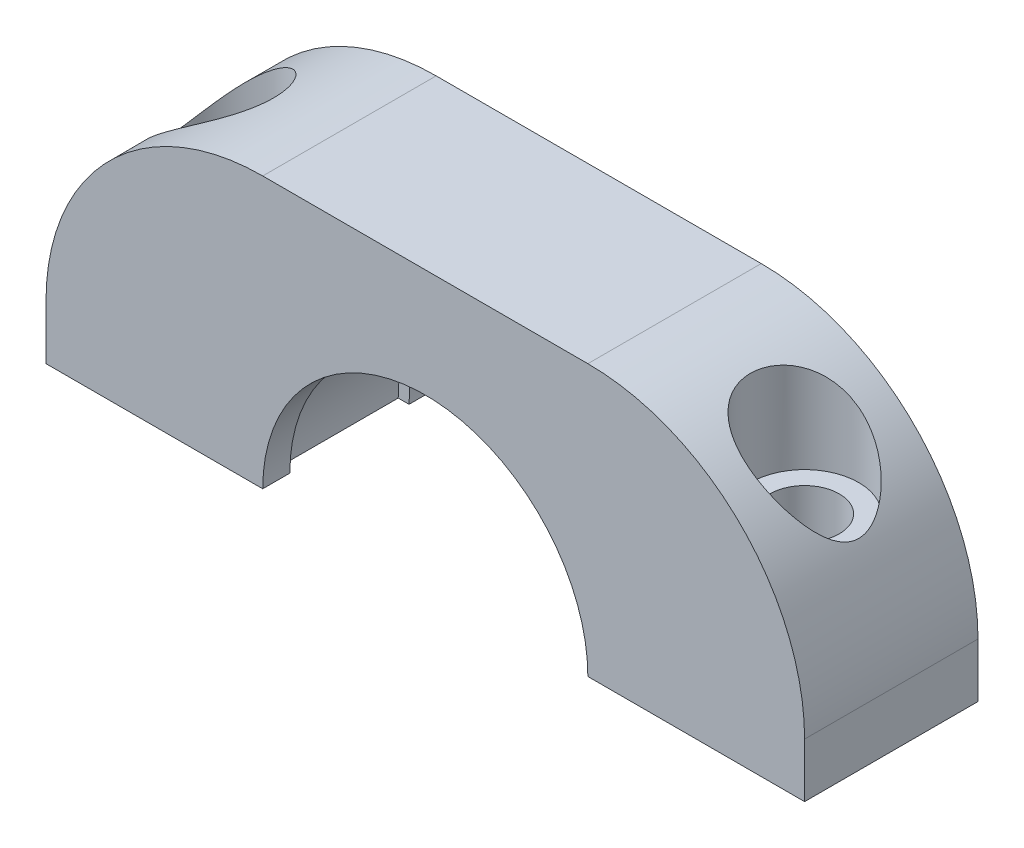
ISO-10303-21;
HEADER;
FILE_DESCRIPTION(('STEP AP214'),'2;1');
FILE_NAME('part.step','',(''),(''),'','','');
FILE_SCHEMA(('AUTOMOTIVE_DESIGN { 1 0 10303 214 1 1 1 1 }'));
ENDSEC;
DATA;
#1=APPLICATION_CONTEXT('core data for automotive mechanical design processes');
#2=APPLICATION_PROTOCOL_DEFINITION('international standard','automotive_design',2000,#1);
#3=PRODUCT_CONTEXT('',#1,'mechanical');
#4=PRODUCT('Part','Part','',(#3));
#5=PRODUCT_RELATED_PRODUCT_CATEGORY('part','',(#4));
#6=PRODUCT_DEFINITION_FORMATION('','',#4);
#7=PRODUCT_DEFINITION_CONTEXT('part definition',#1,'design');
#8=PRODUCT_DEFINITION('design','',#6,#7);
#9=PRODUCT_DEFINITION_SHAPE('','',#8);
#10=(LENGTH_UNIT() NAMED_UNIT(*) SI_UNIT(.MILLI.,.METRE.));
#11=(NAMED_UNIT(*) PLANE_ANGLE_UNIT() SI_UNIT($,.RADIAN.));
#12=(NAMED_UNIT(*) SI_UNIT($,.STERADIAN.) SOLID_ANGLE_UNIT());
#13=UNCERTAINTY_MEASURE_WITH_UNIT(LENGTH_MEASURE(1.E-05),#10,'distance_accuracy_value','');
#14=(GEOMETRIC_REPRESENTATION_CONTEXT(3) GLOBAL_UNCERTAINTY_ASSIGNED_CONTEXT((#13)) GLOBAL_UNIT_ASSIGNED_CONTEXT((#10,
#11,#12)) REPRESENTATION_CONTEXT('',''));
#15=CARTESIAN_POINT('',(0.,0.,0.));
#16=DIRECTION('',(0.,0.,1.));
#17=DIRECTION('',(1.,0.,0.));
#18=AXIS2_PLACEMENT_3D('',#15,#16,#17);
#19=CARTESIAN_POINT('',(0.,0.,0.));
#20=DIRECTION('',(0.,-1.,0.));
#21=DIRECTION('',(0.,0.,-1.));
#22=AXIS2_PLACEMENT_3D('',#19,#20,#21);
#23=PLANE('',#22);
#24=CARTESIAN_POINT('',(13.5000000000004,0.,0.));
#25=DIRECTION('',(0.,-1.,0.));
#26=DIRECTION('',(0.,0.,-1.));
#27=AXIS2_PLACEMENT_3D('',#24,#25,#26);
#28=CIRCLE('',#27,1.6);
#29=CARTESIAN_POINT('',(13.5000000000004,0.,-1.59999999999997));
#30=VERTEX_POINT('',#29);
#31=EDGE_CURVE('E154',#30,#30,#28,.T.);
#32=ORIENTED_EDGE('',*,*,#31,.F.);
#33=EDGE_LOOP('',(#32));
#34=FACE_BOUND('',#33,.T.);
#35=DIRECTION('',(0.,0.,1.));
#36=VECTOR('',#35,1.);
#37=CARTESIAN_POINT('',(8.,0.,-2.75));
#38=LINE('',#37,#36);
#39=CARTESIAN_POINT('',(8.,0.,-2.75));
#40=VERTEX_POINT('',#39);
#41=CARTESIAN_POINT('',(8.,0.,2.75));
#42=VERTEX_POINT('',#41);
#43=EDGE_CURVE('E140',#40,#42,#38,.T.);
#44=ORIENTED_EDGE('',*,*,#43,.F.);
#45=DIRECTION('',(-1.,0.,0.));
#46=VECTOR('',#45,1.);
#47=CARTESIAN_POINT('',(0.,0.,-2.75));
#48=LINE('',#47,#46);
#49=CARTESIAN_POINT('',(7.50000000000001,0.,-2.75));
#50=VERTEX_POINT('',#49);
#51=EDGE_CURVE('E149',#40,#50,#48,.T.);
#52=ORIENTED_EDGE('',*,*,#51,.T.);
#53=DIRECTION('',(0.,0.,1.));
#54=VECTOR('',#53,1.);
#55=CARTESIAN_POINT('',(7.50000000000001,0.,-4.00100000000001));
#56=LINE('',#55,#54);
#57=CARTESIAN_POINT('',(7.50000000000001,0.,-4.00000000000001));
#58=VERTEX_POINT('',#57);
#59=EDGE_CURVE('E169',#50,#58,#56,.F.);
#60=ORIENTED_EDGE('',*,*,#59,.T.);
#61=DIRECTION('',(-1.,0.,0.));
#62=VECTOR('',#61,1.);
#63=CARTESIAN_POINT('',(-17.5,0.,-4.00000000000001));
#64=LINE('',#63,#62);
#65=CARTESIAN_POINT('',(17.5,0.,-4.00000000000001));
#66=VERTEX_POINT('',#65);
#67=EDGE_CURVE('E189',#66,#58,#64,.T.);
#68=ORIENTED_EDGE('',*,*,#67,.F.);
#69=DIRECTION('',(0.,0.,-1.));
#70=VECTOR('',#69,1.);
#71=CARTESIAN_POINT('',(17.5,0.,3.99999999999999));
#72=LINE('',#71,#70);
#73=CARTESIAN_POINT('',(17.5,0.,3.99999999999999));
#74=VERTEX_POINT('',#73);
#75=EDGE_CURVE('E177',#74,#66,#72,.T.);
#76=ORIENTED_EDGE('',*,*,#75,.F.);
#77=DIRECTION('',(1.,0.,0.));
#78=VECTOR('',#77,1.);
#79=CARTESIAN_POINT('',(-17.5,0.,3.99999999999999));
#80=LINE('',#79,#78);
#81=CARTESIAN_POINT('',(7.50000000000001,0.,3.99999999999999));
#82=VERTEX_POINT('',#81);
#83=EDGE_CURVE('E195',#82,#74,#80,.T.);
#84=ORIENTED_EDGE('',*,*,#83,.F.);
#85=CARTESIAN_POINT('',(7.50000000000001,0.,2.75));
#86=VERTEX_POINT('',#85);
#87=EDGE_CURVE('E158',#82,#86,#56,.F.);
#88=ORIENTED_EDGE('',*,*,#87,.T.);
#89=DIRECTION('',(-1.,0.,0.));
#90=VECTOR('',#89,1.);
#91=CARTESIAN_POINT('',(0.,0.,2.75));
#92=LINE('',#91,#90);
#93=EDGE_CURVE('E65',#42,#86,#92,.T.);
#94=ORIENTED_EDGE('',*,*,#93,.F.);
#95=EDGE_LOOP('',(#44,#52,#60,#68,#76,#84,#88,#94));
#96=FACE_BOUND('',#95,.T.);
#97=ADVANCED_FACE('F43',(#34,#96),#23,.T.);
#98=CARTESIAN_POINT('',(-13.4999999999997,0.,0.));
#99=DIRECTION('',(0.,-1.,0.));
#100=DIRECTION('',(0.,0.,-1.));
#101=AXIS2_PLACEMENT_3D('',#98,#99,#100);
#102=CIRCLE('',#101,1.6);
#103=CARTESIAN_POINT('',(-13.4999999999997,0.,-1.60000000000006));
#104=VERTEX_POINT('',#103);
#105=EDGE_CURVE('E327',#104,#104,#102,.T.);
#106=ORIENTED_EDGE('',*,*,#105,.F.);
#107=EDGE_LOOP('',(#106));
#108=FACE_BOUND('',#107,.T.);
#109=DIRECTION('',(0.,0.,1.));
#110=VECTOR('',#109,1.);
#111=CARTESIAN_POINT('',(-7.49999999999999,0.,-4.00100000000001));
#112=LINE('',#111,#110);
#113=CARTESIAN_POINT('',(-7.49999999999999,0.,-4.00000000000001));
#114=VERTEX_POINT('',#113);
#115=CARTESIAN_POINT('',(-7.49999999999999,0.,-2.75));
#116=VERTEX_POINT('',#115);
#117=EDGE_CURVE('E166',#114,#116,#112,.T.);
#118=ORIENTED_EDGE('',*,*,#117,.T.);
#119=DIRECTION('',(-1.,0.,0.));
#120=VECTOR('',#119,1.);
#121=CARTESIAN_POINT('',(0.,0.,-2.75));
#122=LINE('',#121,#120);
#123=CARTESIAN_POINT('',(-8.,0.,-2.75));
#124=VERTEX_POINT('',#123);
#125=EDGE_CURVE('E159',#116,#124,#122,.T.);
#126=ORIENTED_EDGE('',*,*,#125,.T.);
#127=DIRECTION('',(0.,0.,1.));
#128=VECTOR('',#127,1.);
#129=CARTESIAN_POINT('',(-8.,0.,-2.75));
#130=LINE('',#129,#128);
#131=CARTESIAN_POINT('',(-8.,0.,2.75));
#132=VERTEX_POINT('',#131);
#133=EDGE_CURVE('E11',#132,#124,#130,.F.);
#134=ORIENTED_EDGE('',*,*,#133,.F.);
#135=DIRECTION('',(-1.,0.,0.));
#136=VECTOR('',#135,1.);
#137=CARTESIAN_POINT('',(0.,0.,2.75));
#138=LINE('',#137,#136);
#139=CARTESIAN_POINT('',(-7.49999999999999,0.,2.75));
#140=VERTEX_POINT('',#139);
#141=EDGE_CURVE('E153',#140,#132,#138,.T.);
#142=ORIENTED_EDGE('',*,*,#141,.F.);
#143=CARTESIAN_POINT('',(-7.49999999999999,0.,3.99999999999999));
#144=VERTEX_POINT('',#143);
#145=EDGE_CURVE('E148',#140,#144,#112,.T.);
#146=ORIENTED_EDGE('',*,*,#145,.T.);
#147=CARTESIAN_POINT('',(-17.5,0.,3.99999999999999));
#148=VERTEX_POINT('',#147);
#149=EDGE_CURVE('E182',#148,#144,#80,.T.);
#150=ORIENTED_EDGE('',*,*,#149,.F.);
#151=DIRECTION('',(0.,0.,1.));
#152=VECTOR('',#151,1.);
#153=CARTESIAN_POINT('',(-17.5,0.,3.99999999999999));
#154=LINE('',#153,#152);
#155=CARTESIAN_POINT('',(-17.5,0.,-4.00000000000001));
#156=VERTEX_POINT('',#155);
#157=EDGE_CURVE('E192',#156,#148,#154,.T.);
#158=ORIENTED_EDGE('',*,*,#157,.F.);
#159=EDGE_CURVE('E188',#114,#156,#64,.T.);
#160=ORIENTED_EDGE('',*,*,#159,.F.);
#161=EDGE_LOOP('',(#118,#126,#134,#142,#146,#150,#158,#160));
#162=FACE_BOUND('',#161,.T.);
#163=ADVANCED_FACE('F274',(#108,#162),#23,.T.);
#164=CARTESIAN_POINT('',(0.,0.,-4.00100000000001));
#165=DIRECTION('',(0.,0.,1.));
#166=DIRECTION('',(1.,0.,0.));
#167=AXIS2_PLACEMENT_3D('',#164,#165,#166);
#168=CYLINDRICAL_SURFACE('',#167,7.5);
#169=CARTESIAN_POINT('',(0.,0.,-2.75));
#170=DIRECTION('',(0.,0.,1.));
#171=DIRECTION('',(1.,0.,0.));
#172=AXIS2_PLACEMENT_3D('',#169,#170,#171);
#173=CIRCLE('',#172,7.5);
#174=EDGE_CURVE('E57',#116,#50,#173,.F.);
#175=ORIENTED_EDGE('',*,*,#174,.F.);
#176=ORIENTED_EDGE('',*,*,#117,.F.);
#177=CARTESIAN_POINT('',(0.,0.,-4.00000000000001));
#178=DIRECTION('',(0.,0.,1.));
#179=DIRECTION('',(1.,0.,0.));
#180=AXIS2_PLACEMENT_3D('',#177,#178,#179);
#181=CIRCLE('',#180,7.5);
#182=EDGE_CURVE('E174',#114,#58,#181,.F.);
#183=ORIENTED_EDGE('',*,*,#182,.T.);
#184=ORIENTED_EDGE('',*,*,#59,.F.);
#185=EDGE_LOOP('',(#175,#176,#183,#184));
#186=FACE_BOUND('',#185,.T.);
#187=ADVANCED_FACE('F267',(#186),#168,.F.);
#188=CARTESIAN_POINT('',(17.5,12.5,3.99999999999999));
#189=DIRECTION('',(-1.,0.,0.));
#190=DIRECTION('',(0.,0.,1.));
#191=AXIS2_PLACEMENT_3D('',#188,#189,#190);
#192=PLANE('',#191);
#193=DIRECTION('',(0.,-1.,0.));
#194=VECTOR('',#193,1.);
#195=CARTESIAN_POINT('',(17.5,12.5,-4.00000000000001));
#196=LINE('',#195,#194);
#197=CARTESIAN_POINT('',(17.5,2.5,-4.00000000000001));
#198=VERTEX_POINT('',#197);
#199=EDGE_CURVE('E203',#198,#66,#196,.T.);
#200=ORIENTED_EDGE('',*,*,#199,.F.);
#201=DIRECTION('',(0.,0.,-1.));
#202=VECTOR('',#201,1.);
#203=CARTESIAN_POINT('',(17.5,2.5,3.99999999999999));
#204=LINE('',#203,#202);
#205=CARTESIAN_POINT('',(17.5,2.5,3.99999999999999));
#206=VERTEX_POINT('',#205);
#207=EDGE_CURVE('E215',#198,#206,#204,.F.);
#208=ORIENTED_EDGE('',*,*,#207,.T.);
#209=DIRECTION('',(0.,-1.,0.));
#210=VECTOR('',#209,1.);
#211=CARTESIAN_POINT('',(17.5,12.5,3.99999999999999));
#212=LINE('',#211,#210);
#213=EDGE_CURVE('E185',#206,#74,#212,.T.);
#214=ORIENTED_EDGE('',*,*,#213,.T.);
#215=ORIENTED_EDGE('',*,*,#75,.T.);
#216=EDGE_LOOP('',(#200,#208,#214,#215));
#217=FACE_BOUND('',#216,.T.);
#218=ADVANCED_FACE('F285',(#217),#192,.F.);
#219=CARTESIAN_POINT('',(-17.5,12.5,-4.00000000000001));
#220=DIRECTION('',(0.,0.,1.));
#221=DIRECTION('',(1.,0.,0.));
#222=AXIS2_PLACEMENT_3D('',#219,#220,#221);
#223=PLANE('',#222);
#224=DIRECTION('',(-1.,0.,0.));
#225=VECTOR('',#224,1.);
#226=CARTESIAN_POINT('',(-17.5,12.5,-4.00000000000001));
#227=LINE('',#226,#225);
#228=CARTESIAN_POINT('',(7.50000000000001,12.5,-4.00000000000001));
#229=VERTEX_POINT('',#228);
#230=CARTESIAN_POINT('',(-7.49999999999999,12.5,-4.00000000000001));
#231=VERTEX_POINT('',#230);
#232=EDGE_CURVE('E178',#229,#231,#227,.T.);
#233=ORIENTED_EDGE('',*,*,#232,.F.);
#234=CARTESIAN_POINT('',(7.50000000000002,2.5,-4.00000000000001));
#235=DIRECTION('',(0.,0.,1.));
#236=DIRECTION('',(1.,0.,0.));
#237=AXIS2_PLACEMENT_3D('',#234,#235,#236);
#238=CIRCLE('',#237,10.);
#239=EDGE_CURVE('E213',#229,#198,#238,.F.);
#240=ORIENTED_EDGE('',*,*,#239,.T.);
#241=ORIENTED_EDGE('',*,*,#199,.T.);
#242=ORIENTED_EDGE('',*,*,#67,.T.);
#243=ORIENTED_EDGE('',*,*,#182,.F.);
#244=ORIENTED_EDGE('',*,*,#159,.T.);
#245=DIRECTION('',(0.,-1.,0.));
#246=VECTOR('',#245,1.);
#247=CARTESIAN_POINT('',(-17.5,12.5,-4.00000000000001));
#248=LINE('',#247,#246);
#249=CARTESIAN_POINT('',(-17.5,2.5,-4.00000000000001));
#250=VERTEX_POINT('',#249);
#251=EDGE_CURVE('E201',#250,#156,#248,.T.);
#252=ORIENTED_EDGE('',*,*,#251,.F.);
#253=CARTESIAN_POINT('',(-7.49999999999999,2.5,-4.00000000000001));
#254=DIRECTION('',(0.,0.,1.));
#255=DIRECTION('',(1.,0.,0.));
#256=AXIS2_PLACEMENT_3D('',#253,#254,#255);
#257=CIRCLE('',#256,10.);
#258=EDGE_CURVE('E211',#250,#231,#257,.F.);
#259=ORIENTED_EDGE('',*,*,#258,.T.);
#260=EDGE_LOOP('',(#233,#240,#241,#242,#243,#244,#252,#259));
#261=FACE_BOUND('',#260,.T.);
#262=ADVANCED_FACE('F281',(#261),#223,.F.);
#263=CARTESIAN_POINT('',(-17.5,12.5,3.99999999999999));
#264=DIRECTION('',(1.,0.,0.));
#265=DIRECTION('',(0.,0.,-1.));
#266=AXIS2_PLACEMENT_3D('',#263,#264,#265);
#267=PLANE('',#266);
#268=DIRECTION('',(0.,-1.,0.));
#269=VECTOR('',#268,1.);
#270=CARTESIAN_POINT('',(-17.5,12.5,3.99999999999999));
#271=LINE('',#270,#269);
#272=CARTESIAN_POINT('',(-17.5,2.5,3.99999999999999));
#273=VERTEX_POINT('',#272);
#274=EDGE_CURVE('E199',#273,#148,#271,.T.);
#275=ORIENTED_EDGE('',*,*,#274,.F.);
#276=DIRECTION('',(0.,0.,1.));
#277=VECTOR('',#276,1.);
#278=CARTESIAN_POINT('',(-17.5,2.5,3.99999999999999));
#279=LINE('',#278,#277);
#280=EDGE_CURVE('E220',#273,#250,#279,.F.);
#281=ORIENTED_EDGE('',*,*,#280,.T.);
#282=ORIENTED_EDGE('',*,*,#251,.T.);
#283=ORIENTED_EDGE('',*,*,#157,.T.);
#284=EDGE_LOOP('',(#275,#281,#282,#283));
#285=FACE_BOUND('',#284,.T.);
#286=ADVANCED_FACE('F278',(#285),#267,.F.);
#287=CARTESIAN_POINT('',(-17.5,12.5,3.99999999999999));
#288=DIRECTION('',(0.,0.,-1.));
#289=DIRECTION('',(-1.,0.,0.));
#290=AXIS2_PLACEMENT_3D('',#287,#288,#289);
#291=PLANE('',#290);
#292=ORIENTED_EDGE('',*,*,#213,.F.);
#293=CARTESIAN_POINT('',(7.50000000000002,2.5,3.99999999999999));
#294=DIRECTION('',(0.,0.,-1.));
#295=DIRECTION('',(-1.,0.,0.));
#296=AXIS2_PLACEMENT_3D('',#293,#294,#295);
#297=CIRCLE('',#296,10.);
#298=CARTESIAN_POINT('',(7.50000000000001,12.5,3.99999999999999));
#299=VERTEX_POINT('',#298);
#300=EDGE_CURVE('E218',#206,#299,#297,.F.);
#301=ORIENTED_EDGE('',*,*,#300,.T.);
#302=DIRECTION('',(1.,0.,0.));
#303=VECTOR('',#302,1.);
#304=CARTESIAN_POINT('',(-17.5,12.5,3.99999999999999));
#305=LINE('',#304,#303);
#306=CARTESIAN_POINT('',(-7.49999999999999,12.5,3.99999999999999));
#307=VERTEX_POINT('',#306);
#308=EDGE_CURVE('E181',#307,#299,#305,.T.);
#309=ORIENTED_EDGE('',*,*,#308,.F.);
#310=CARTESIAN_POINT('',(-7.49999999999999,2.5,3.99999999999999));
#311=DIRECTION('',(0.,0.,-1.));
#312=DIRECTION('',(-1.,0.,0.));
#313=AXIS2_PLACEMENT_3D('',#310,#311,#312);
#314=CIRCLE('',#313,10.);
#315=EDGE_CURVE('E73',#307,#273,#314,.F.);
#316=ORIENTED_EDGE('',*,*,#315,.T.);
#317=ORIENTED_EDGE('',*,*,#274,.T.);
#318=ORIENTED_EDGE('',*,*,#149,.T.);
#319=CARTESIAN_POINT('',(0.,0.,3.99999999999999));
#320=DIRECTION('',(0.,0.,1.));
#321=DIRECTION('',(1.,0.,0.));
#322=AXIS2_PLACEMENT_3D('',#319,#320,#321);
#323=CIRCLE('',#322,7.5);
#324=EDGE_CURVE('E171',#82,#144,#323,.T.);
#325=ORIENTED_EDGE('',*,*,#324,.F.);
#326=ORIENTED_EDGE('',*,*,#83,.T.);
#327=EDGE_LOOP('',(#292,#301,#309,#316,#317,#318,#325,#326));
#328=FACE_BOUND('',#327,.T.);
#329=ADVANCED_FACE('F270',(#328),#291,.F.);
#330=CARTESIAN_POINT('',(0.,12.5,0.));
#331=DIRECTION('',(0.,-1.,0.));
#332=DIRECTION('',(0.,0.,-1.));
#333=AXIS2_PLACEMENT_3D('',#330,#331,#332);
#334=PLANE('',#333);
#335=ORIENTED_EDGE('',*,*,#308,.T.);
#336=DIRECTION('',(0.,0.,-1.));
#337=VECTOR('',#336,1.);
#338=CARTESIAN_POINT('',(7.50000000000002,12.5,0.));
#339=LINE('',#338,#337);
#340=EDGE_CURVE('E208',#299,#229,#339,.T.);
#341=ORIENTED_EDGE('',*,*,#340,.T.);
#342=ORIENTED_EDGE('',*,*,#232,.T.);
#343=DIRECTION('',(0.,0.,1.));
#344=VECTOR('',#343,1.);
#345=CARTESIAN_POINT('',(-7.49999999999999,12.5,0.));
#346=LINE('',#345,#344);
#347=EDGE_CURVE('E205',#231,#307,#346,.T.);
#348=ORIENTED_EDGE('',*,*,#347,.T.);
#349=EDGE_LOOP('',(#335,#341,#342,#348));
#350=FACE_BOUND('',#349,.T.);
#351=ADVANCED_FACE('F265',(#350),#334,.F.);
#352=ORIENTED_EDGE('',*,*,#145,.F.);
#353=CARTESIAN_POINT('',(0.,0.,2.75));
#354=DIRECTION('',(0.,0.,1.));
#355=DIRECTION('',(1.,0.,0.));
#356=AXIS2_PLACEMENT_3D('',#353,#354,#355);
#357=CIRCLE('',#356,7.5);
#358=EDGE_CURVE('E222',#140,#86,#357,.F.);
#359=ORIENTED_EDGE('',*,*,#358,.T.);
#360=ORIENTED_EDGE('',*,*,#87,.F.);
#361=ORIENTED_EDGE('',*,*,#324,.T.);
#362=EDGE_LOOP('',(#352,#359,#360,#361));
#363=FACE_BOUND('',#362,.T.);
#364=ADVANCED_FACE('F261',(#363),#168,.F.);
#365=CARTESIAN_POINT('',(7.50000000000002,2.5,0.));
#366=DIRECTION('',(0.,0.,-1.));
#367=DIRECTION('',(-1.,0.,0.));
#368=AXIS2_PLACEMENT_3D('',#365,#366,#367);
#369=CYLINDRICAL_SURFACE('',#368,10.);
#370=CARTESIAN_POINT('',(13.5000000000004,10.4999999999997,-2.49999999999996));
#371=CARTESIAN_POINT('',(13.3559478408814,10.6080319651939,-2.49999772423982));
#372=CARTESIAN_POINT('',(13.208845161749,10.7122405858319,-2.48755041843695));
#373=CARTESIAN_POINT('',(12.9127726950307,10.9103228869833,-2.43468941072614));
#374=CARTESIAN_POINT('',(12.7638054218619,11.0042091006609,-2.39431006755304));
#375=CARTESIAN_POINT('',(12.4924166538859,11.1658399595462,-2.29182123040513));
#376=CARTESIAN_POINT('',(12.3694458182336,11.2353829616956,-2.23402604686917));
#377=CARTESIAN_POINT('',(12.1307261504453,11.3642401190074,-2.09620025636092));
#378=CARTESIAN_POINT('',(12.0149753186139,11.4235571145258,-2.01617583991626));
#379=CARTESIAN_POINT('',(11.7952384328544,11.5313902345097,-1.83418311318419));
#380=CARTESIAN_POINT('',(11.691310655496,11.579853908873,-1.73211273360141));
#381=CARTESIAN_POINT('',(11.5010520126849,11.6652877427814,-1.50855046435219));
#382=CARTESIAN_POINT('',(11.4147163212434,11.7022610559115,-1.38706391743191));
#383=CARTESIAN_POINT('',(11.2708921317242,11.7620686029273,-1.14002910248165));
#384=CARTESIAN_POINT('',(11.2115179048796,11.7858695794752,-1.01580881020896));
#385=CARTESIAN_POINT('',(11.1137222911302,11.8243656713744,-0.758062883041885));
#386=CARTESIAN_POINT('',(11.0752949293199,11.8390633835136,-0.62453991392135));
#387=CARTESIAN_POINT('',(11.0222287001027,11.8592028375177,-0.358190899611803));
#388=CARTESIAN_POINT('',(11.0066390517087,11.8650149917511,-0.225581206563188));
#389=CARTESIAN_POINT('',(10.9967864136587,11.8686987826734,0.0405327771972194));
#390=CARTESIAN_POINT('',(11.0025211345534,11.866571271789,0.174036970336573));
#391=CARTESIAN_POINT('',(11.0349148030809,11.8543927965867,0.436667410209446));
#392=CARTESIAN_POINT('',(11.0613520151874,11.8444257927501,0.565825010602815));
#393=CARTESIAN_POINT('',(11.1338416686638,11.8164741825129,0.817589701052352));
#394=CARTESIAN_POINT('',(11.1798933206906,11.7984898987501,0.940197054486419));
#395=CARTESIAN_POINT('',(11.290064011451,11.7541308687928,1.17610014104693));
#396=CARTESIAN_POINT('',(11.3542698692174,11.7277157234523,1.28934766459011));
#397=CARTESIAN_POINT('',(11.4980887772568,11.6663176495844,1.50297595617567));
#398=CARTESIAN_POINT('',(11.5777022909752,11.6313344633314,1.60335633703747));
#399=CARTESIAN_POINT('',(11.7514812540983,11.5517540033054,1.79151000214958));
#400=CARTESIAN_POINT('',(11.8459727963675,11.5069292424906,1.87888496629733));
#401=CARTESIAN_POINT('',(12.0442626813935,11.4085309293614,2.03638828422385));
#402=CARTESIAN_POINT('',(12.1480629690049,11.3549555468704,2.10651302244409));
#403=CARTESIAN_POINT('',(12.3687378207265,11.2356831240319,2.23327885820231));
#404=CARTESIAN_POINT('',(12.4860204181198,11.1694051480698,2.28865761108608));
#405=CARTESIAN_POINT('',(12.7232219015794,11.0285997155952,2.37965974746942));
#406=CARTESIAN_POINT('',(12.8431420059305,10.9540683798174,2.41527379342896));
#407=CARTESIAN_POINT('',(13.0982810220914,10.7876642377426,2.47140990942904));
#408=CARTESIAN_POINT('',(13.233425198152,10.6948016654184,2.48931228884617));
#409=CARTESIAN_POINT('',(13.4996292202347,10.5019706695487,2.50355663502262));
#410=CARTESIAN_POINT('',(13.6306873672547,10.4019993453503,2.49988975021342));
#411=CARTESIAN_POINT('',(13.9111433825634,10.1769438052437,2.47072759127329));
#412=CARTESIAN_POINT('',(14.0592066031496,10.0507334718261,2.44116082291864));
#413=CARTESIAN_POINT('',(14.344158560662,9.7934506568168,2.35785640311096));
#414=CARTESIAN_POINT('',(14.4810302413553,9.66237118088685,2.30408264194115));
#415=CARTESIAN_POINT('',(14.6903039342919,9.45069418046284,2.20020816585068));
#416=CARTESIAN_POINT('',(14.7667992114219,9.37062843782144,2.15706161669019));
#417=CARTESIAN_POINT('',(14.914876250481,9.21054992194644,2.06296406076529));
#418=CARTESIAN_POINT('',(14.9864591234771,9.13053714081572,2.01201482725988));
#419=CARTESIAN_POINT('',(15.124411368148,8.97143190926609,1.90237973426254));
#420=CARTESIAN_POINT('',(15.1907841157747,8.89233889166131,1.8436989516508));
#421=CARTESIAN_POINT('',(15.3180002088554,8.73610554088133,1.71838366574082));
#422=CARTESIAN_POINT('',(15.3788466551229,8.65896413040906,1.65175367192322));
#423=CARTESIAN_POINT('',(15.5029009125985,8.49711569849689,1.49978790012875));
#424=CARTESIAN_POINT('',(15.5651863195743,8.41291953770303,1.41314015218397));
#425=CARTESIAN_POINT('',(15.6806338233842,8.25212773998968,1.22750585338542));
#426=CARTESIAN_POINT('',(15.7338064218263,8.17552339779441,1.12853373545942));
#427=CARTESIAN_POINT('',(15.8168847052236,8.05279136308059,0.943194232985673));
#428=CARTESIAN_POINT('',(15.8492845324432,8.00383062402089,0.859853608347273));
#429=CARTESIAN_POINT('',(15.9060387185737,7.9167528209656,0.685106240772761));
#430=CARTESIAN_POINT('',(15.9304088272003,7.87861455012423,0.593715738969404));
#431=CARTESIAN_POINT('',(15.9645911082919,7.8246110657962,0.425832544516583));
#432=CARTESIAN_POINT('',(15.9764660962554,7.80563538488588,0.350778012383965));
#433=CARTESIAN_POINT('',(15.9933285294874,7.77860149536596,0.197985526832633));
#434=CARTESIAN_POINT('',(15.9983241257531,7.77053036679157,0.120250861137076));
#435=CARTESIAN_POINT('',(16.0009642615116,7.76627153620477,-0.0358965525999676));
#436=CARTESIAN_POINT('',(15.9985885267275,7.77011660874879,-0.114310578215029));
#437=CARTESIAN_POINT('',(15.986683481852,7.7892647546462,-0.26917740405603));
#438=CARTESIAN_POINT('',(15.9771474220576,7.80457863907568,-0.345628283348453));
#439=CARTESIAN_POINT('',(15.9484586816534,7.85018033972764,-0.513896660105879));
#440=CARTESIAN_POINT('',(15.9274650868916,7.88330391985668,-0.604617475680813));
#441=CARTESIAN_POINT('',(15.8773851415339,7.96091153389674,-0.77864477890281));
#442=CARTESIAN_POINT('',(15.8482804337674,8.00542131822638,-0.861933875771614));
#443=CARTESIAN_POINT('',(15.7643920655351,8.13101605063231,-1.06832126015484));
#444=CARTESIAN_POINT('',(15.7046249659419,8.21812076394864,-1.18567436178591));
#445=CARTESIAN_POINT('',(15.5726304905793,8.40302183895136,-1.4037437017148));
#446=CARTESIAN_POINT('',(15.5003697220883,8.50084658944993,-1.5044139007277));
#447=CARTESIAN_POINT('',(15.3629147786015,8.67934245139178,-1.66982659127213));
#448=CARTESIAN_POINT('',(15.2998075544384,8.75890096624952,-1.73754944858488));
#449=CARTESIAN_POINT('',(15.1677991016714,8.91994536682123,-1.86463101504608));
#450=CARTESIAN_POINT('',(15.098894987626,9.00143219769035,-1.92398551898657));
#451=CARTESIAN_POINT('',(14.9556316873139,9.165238854849,-2.03453273788395));
#452=CARTESIAN_POINT('',(14.8812691695172,9.24755916298173,-2.08572040671759));
#453=CARTESIAN_POINT('',(14.7274130253403,9.41210424906806,-2.17981323016172));
#454=CARTESIAN_POINT('',(14.6479204511008,9.49432904311158,-2.22272007595645));
#455=CARTESIAN_POINT('',(14.4854926200841,9.65652390101124,-2.29928735842783));
#456=CARTESIAN_POINT('',(14.4026417325629,9.73650826345966,-2.33309619030304));
#457=CARTESIAN_POINT('',(14.2325332971671,9.89503307397408,-2.39196493336511));
#458=CARTESIAN_POINT('',(14.1452752771679,9.97357336610605,-2.41702390491727));
#459=CARTESIAN_POINT('',(13.9669079573967,10.1284348080929,-2.45771183009382));
#460=CARTESIAN_POINT('',(13.8758050628542,10.2047593169431,-2.47335585241332));
#461=CARTESIAN_POINT('',(13.6902503852094,10.3546188988971,-2.49449893904281));
#462=CARTESIAN_POINT('',(13.5957997723436,10.4281549285014,-2.50000151346081));
#463=CARTESIAN_POINT('',(13.5000000000004,10.4999999999997,-2.49999999999996));
#464=B_SPLINE_CURVE_WITH_KNOTS('',3,(#370,#371,#372,#373,#374,#375,#376,#377,#378,#379,#380,
#381,#382,#383,#384,#385,#386,#387,#388,#389,#390,#391,#392,#393,#394,#395,#396,#397,#398,#399,
#400,#401,#402,#403,#404,#405,#406,#407,#408,#409,#410,#411,#412,#413,#414,#415,#416,#417,#418,
#419,#420,#421,#422,#423,#424,#425,#426,#427,#428,#429,#430,#431,#432,#433,#434,#435,#436,#437,
#438,#439,#440,#441,#442,#443,#444,#445,#446,#447,#448,#449,#450,#451,#452,#453,#454,#455,#456,
#457,#458,#459,#460,#461,#462,#463),.UNSPECIFIED.,.T.,.F.,(4,2,2,2,2,2,2,2,2,2,2,2,2,2,2,2,2,2,
2,2,2,2,2,2,2,2,2,2,2,2,2,2,2,2,2,2,2,2,2,2,2,2,2,2,2,2,4),(0.,0.539829430697364,
1.07899600426285,1.53496953850189,1.99081621763225,2.44882045128061,2.90669887222175,
3.32375152327574,3.74068515146472,4.13971245301784,4.53869691502114,4.93346551912776,
5.32821823807757,5.72489167898101,6.12157705324269,6.52863579809554,6.93577978781062,
7.37098347275845,7.8063925885268,8.29940027799574,8.79261030147449,9.38089395821535,
9.97005808417664,10.3262752670155,10.6824116147862,11.0383152622946,11.3940179619857,
11.8009589461599,12.2074277709489,12.5123655578824,12.8167016205111,13.0507041444235,
13.2844291728999,13.5187976133028,13.7533872596443,14.048231122054,14.3437477748863,
14.8148235707112,15.2871784781704,15.6529065793269,16.0188178135913,16.3849542687205,
16.7510158688539,17.1106844688386,17.4703916812385,17.8295216378591,18.1885272708277),.UNSPECIFIED.);
#465=CARTESIAN_POINT('',(13.5000000000004,10.4999999999997,-2.49999999999996));
#466=VERTEX_POINT('',#465);
#467=EDGE_CURVE('E48',#466,#466,#464,.T.);
#468=ORIENTED_EDGE('',*,*,#467,.F.);
#469=EDGE_LOOP('',(#468));
#470=FACE_BOUND('',#469,.T.);
#471=ORIENTED_EDGE('',*,*,#300,.F.);
#472=ORIENTED_EDGE('',*,*,#207,.F.);
#473=ORIENTED_EDGE('',*,*,#239,.F.);
#474=ORIENTED_EDGE('',*,*,#340,.F.);
#475=EDGE_LOOP('',(#471,#472,#473,#474));
#476=FACE_BOUND('',#475,.T.);
#477=ADVANCED_FACE('F264',(#470,#476),#369,.T.);
#478=CARTESIAN_POINT('',(-7.49999999999999,2.5,0.));
#479=DIRECTION('',(0.,0.,1.));
#480=DIRECTION('',(1.,0.,0.));
#481=AXIS2_PLACEMENT_3D('',#478,#479,#480);
#482=CYLINDRICAL_SURFACE('',#481,10.);
#483=CARTESIAN_POINT('',(-13.4999999999996,10.5000000000003,-2.50000000000003));
#484=CARTESIAN_POINT('',(-13.6693499989501,10.372976901987,-2.49999966998205));
#485=CARTESIAN_POINT('',(-13.8346922410819,10.2404971085674,-2.48279913773452));
#486=CARTESIAN_POINT('',(-14.153395886143,9.9683676673145,-2.41859680639497));
#487=CARTESIAN_POINT('',(-14.3067324821942,9.82870411318631,-2.37153504131659));
#488=CARTESIAN_POINT('',(-14.6094340546772,9.53585282344489,-2.24673645686475));
#489=CARTESIAN_POINT('',(-14.7577607623984,9.38240486978678,-2.16707457723547));
#490=CARTESIAN_POINT('',(-14.9664717116325,9.1530118478654,-2.02644656947337));
#491=CARTESIAN_POINT('',(-15.0337586998764,9.07666073401622,-1.97603471448467));
#492=CARTESIAN_POINT('',(-15.1635467191676,8.92495101277074,-1.86808261742845));
#493=CARTESIAN_POINT('',(-15.2260491813552,8.84959211421303,-1.81054452053967));
#494=CARTESIAN_POINT('',(-15.371594417552,8.66900045154896,-1.66196502382242));
#495=CARTESIAN_POINT('',(-15.4520139259842,8.56474952491935,-1.5671076096034));
#496=CARTESIAN_POINT('',(-15.6009603210845,8.36429143334158,-1.36092923162956));
#497=CARTESIAN_POINT('',(-15.6695070361505,8.26807099895824,-1.24963630377997));
#498=CARTESIAN_POINT('',(-15.7704479091385,8.12180275126903,-1.05015587366757));
#499=CARTESIAN_POINT('',(-15.807121384674,8.06734042870253,-0.967408010604023));
#500=CARTESIAN_POINT('',(-15.8726276040675,7.96832782357878,-0.793259334125203));
#501=CARTESIAN_POINT('',(-15.9014735513943,7.9237608728953,-0.70187344695469));
#502=CARTESIAN_POINT('',(-15.9437187734439,7.85768562589837,-0.532886208114609));
#503=CARTESIAN_POINT('',(-15.9591461627123,7.83322987199143,-0.456966165794742));
#504=CARTESIAN_POINT('',(-15.9830078382327,7.79519512176652,-0.301396472856175));
#505=CARTESIAN_POINT('',(-15.9914517882123,7.78160109580688,-0.221752137839775));
#506=CARTESIAN_POINT('',(-16.0005827716571,7.76689460943645,-0.0603666997082264));
#507=CARTESIAN_POINT('',(-16.0012250058605,7.76585423523431,0.0213838142170444));
#508=CARTESIAN_POINT('',(-15.9945665770721,7.77658705982637,0.183717323937134));
#509=CARTESIAN_POINT('',(-15.9872608083956,7.7883684951719,0.264299535516672));
#510=CARTESIAN_POINT('',(-15.9638852231514,7.82570954668393,0.433039497255188));
#511=CARTESIAN_POINT('',(-15.9467216683053,7.85298273397824,0.520655968539271));
#512=CARTESIAN_POINT('',(-15.9046168031352,7.91885052244695,0.689515578457762));
#513=CARTESIAN_POINT('',(-15.8796600674408,7.95746756792887,0.770745673582201));
#514=CARTESIAN_POINT('',(-15.8080752704152,8.06615352159434,0.969144687599559));
#515=CARTESIAN_POINT('',(-15.7570679703507,8.14185729416271,1.08159531438909));
#516=CARTESIAN_POINT('',(-15.6437093356777,8.30429944722025,1.29183244216203));
#517=CARTESIAN_POINT('',(-15.5813270796706,8.3910677069459,1.38957761297892));
#518=CARTESIAN_POINT('',(-15.4602392130956,8.55332879408511,1.55426994309892));
#519=CARTESIAN_POINT('',(-15.4031662090494,8.62774556414935,1.62351385325375));
#520=CARTESIAN_POINT('',(-15.2834889893796,8.77906098287579,1.75414413163393));
#521=CARTESIAN_POINT('',(-15.220881671202,8.85596100813077,1.81552604457464));
#522=CARTESIAN_POINT('',(-15.0904884554591,9.01112665242806,1.93078252298805));
#523=CARTESIAN_POINT('',(-15.022697785421,9.08939347750776,1.98465003766414));
#524=CARTESIAN_POINT('',(-14.8822732121996,9.24634195629034,2.08488845017232));
#525=CARTESIAN_POINT('',(-14.8096402515756,9.32502352653234,2.13126080096655));
#526=CARTESIAN_POINT('',(-14.6573534432118,9.48461460746156,2.21775628489604));
#527=CARTESIAN_POINT('',(-14.5775494187374,9.56551497862053,2.25763240574316));
#528=CARTESIAN_POINT('',(-14.4132762805709,9.72632871813961,2.32893635917659));
#529=CARTESIAN_POINT('',(-14.3288065518644,9.80624195467258,2.36036307477699));
#530=CARTESIAN_POINT('',(-14.1556784385267,9.96429170569109,2.4141844792379));
#531=CARTESIAN_POINT('',(-14.0670270426093,10.0424308824166,2.43659368029669));
#532=CARTESIAN_POINT('',(-13.885887930335,10.1964008873346,2.47176175262836));
#533=CARTESIAN_POINT('',(-13.793399934457,10.2722315466363,2.48451991945419));
#534=CARTESIAN_POINT('',(-13.5536900596302,10.4616041353595,2.50368480399434));
#535=CARTESIAN_POINT('',(-13.4041704334044,10.5731156588381,2.50281373016316));
#536=CARTESIAN_POINT('',(-13.1010686387285,10.7862692342471,2.47264722797107));
#537=CARTESIAN_POINT('',(-12.947491549569,10.8879229449271,2.44338583892222));
#538=CARTESIAN_POINT('',(-12.6655871462187,11.0638714191028,2.36047401030216));
#539=CARTESIAN_POINT('',(-12.5370610665468,11.1399598044862,2.31134442765357));
#540=CARTESIAN_POINT('',(-12.2854471204363,11.2818177436464,2.18960318724184));
#541=CARTESIAN_POINT('',(-12.1623576258314,11.3475904020716,2.11699861479138));
#542=CARTESIAN_POINT('',(-11.9262813673917,11.4680387505403,1.94797095582147));
#543=CARTESIAN_POINT('',(-11.8133544681146,11.5226508234174,1.85141790705646));
#544=CARTESIAN_POINT('',(-11.6041619077585,11.6197144586537,1.63653437306256));
#545=CARTESIAN_POINT('',(-11.5078898108655,11.6621707224812,1.5182123365275));
#546=CARTESIAN_POINT('',(-11.3460806513917,11.7311767102498,1.27654733974042));
#547=CARTESIAN_POINT('',(-11.2784007912633,11.7589133649844,1.15497261412121));
#548=CARTESIAN_POINT('',(-11.1637550552742,11.8048770987254,0.90076489014197));
#549=CARTESIAN_POINT('',(-11.1167821965188,11.8231073838863,0.768135637599892));
#550=CARTESIAN_POINT('',(-11.0475514100908,11.8496622942183,0.503235426810047));
#551=CARTESIAN_POINT('',(-11.0241152546525,11.8584608249018,0.371318231148759));
#552=CARTESIAN_POINT('',(-10.9986388856794,11.8680157341127,0.10515176215841));
#553=CARTESIAN_POINT('',(-10.9965958392978,11.8687731774302,-0.0290972000429735));
#554=CARTESIAN_POINT('',(-11.0138574402707,11.8623118162392,-0.294054708311404));
#555=CARTESIAN_POINT('',(-11.0328531432526,11.8552084454357,-0.424786367337923));
#556=CARTESIAN_POINT('',(-11.0909544449342,11.8330596786751,-0.680992798318949));
#557=CARTESIAN_POINT('',(-11.1300591519669,11.8180146348644,-0.806467803095614));
#558=CARTESIAN_POINT('',(-11.2269475334115,11.7796855606987,-1.04896022384189));
#559=CARTESIAN_POINT('',(-11.2847726516213,11.7563832392145,-1.16595816313041));
#560=CARTESIAN_POINT('',(-11.4167702095903,11.7013045250127,-1.38811040018908));
#561=CARTESIAN_POINT('',(-11.490942613231,11.6695281510181,-1.4932647241264));
#562=CARTESIAN_POINT('',(-11.6544216664282,11.5966439475547,-1.69135307800607));
#563=CARTESIAN_POINT('',(-11.7440130221185,11.5553544390184,-1.78398466631944));
#564=CARTESIAN_POINT('',(-11.9336972770559,11.4640058155068,-1.95264364698901));
#565=CARTESIAN_POINT('',(-12.0337925344409,11.4139447296057,-2.02866729898824));
#566=CARTESIAN_POINT('',(-12.2470569160842,11.3023155675667,-2.16731581189276));
#567=CARTESIAN_POINT('',(-12.3606494323682,11.2402407203622,-2.22887699197552));
#568=CARTESIAN_POINT('',(-12.5916646145579,11.1077114677318,-2.33259012459076));
#569=CARTESIAN_POINT('',(-12.7090879578005,11.0372555745433,-2.37473862458943));
#570=CARTESIAN_POINT('',(-12.9399443800187,10.8919540418334,-2.43929375772799));
#571=CARTESIAN_POINT('',(-13.053357843269,10.8173802631519,-2.46239532232858));
#572=CARTESIAN_POINT('',(-13.2784109023696,10.6626384600023,-2.49275018465283));
#573=CARTESIAN_POINT('',(-13.3900501277161,10.5824692854456,-2.500000214263));
#574=CARTESIAN_POINT('',(-13.4999999999996,10.5000000000003,-2.50000000000003));
#575=B_SPLINE_CURVE_WITH_KNOTS('',3,(#483,#484,#485,#486,#487,#488,#489,#490,#491,#492,#493,
#494,#495,#496,#497,#498,#499,#500,#501,#502,#503,#504,#505,#506,#507,#508,#509,#510,#511,#512,
#513,#514,#515,#516,#517,#518,#519,#520,#521,#522,#523,#524,#525,#526,#527,#528,#529,#530,#531,
#532,#533,#534,#535,#536,#537,#538,#539,#540,#541,#542,#543,#544,#545,#546,#547,#548,#549,#550,
#551,#552,#553,#554,#555,#556,#557,#558,#559,#560,#561,#562,#563,#564,#565,#566,#567,#568,#569,
#570,#571,#572,#573,#574),.UNSPECIFIED.,.T.,.F.,(4,2,2,2,2,2,2,2,2,2,2,2,2,2,2,2,2,2,2,2,2,2,2,
2,2,2,2,2,2,2,2,2,2,2,2,2,2,2,2,2,2,2,2,2,2,4),(0.,0.634597561666626,1.27047354440363,
1.95108299611664,2.29153647668243,2.63188772011692,3.11754787317366,3.60238895090057,
3.91848474295897,4.23404398282358,4.47683020662469,4.7192798964863,4.96312113498945,
5.20711910620658,5.4856392716885,5.76471425611685,6.19682239124576,6.63012316109475,
6.97940460333402,7.32888311093978,7.67868736144639,8.02842371970882,8.38933463949747,
8.75029324718825,9.11066860588999,9.47107026652632,10.0283664680044,10.5849953092731,
11.0547226378203,11.5243083235792,11.9965003301818,12.4685094609344,12.8919691146463,
13.3152858582215,13.7161607402385,14.116982538272,14.5119955765038,14.9069911007002,
15.3028671268885,15.6987422784149,16.102917537074,16.5071837284506,16.9354552894671,
17.3638029889465,17.7757282343513,18.187738398444),.UNSPECIFIED.);
#576=CARTESIAN_POINT('',(-13.4999999999996,10.5000000000003,-2.50000000000003));
#577=VERTEX_POINT('',#576);
#578=EDGE_CURVE('E231',#577,#577,#575,.T.);
#579=ORIENTED_EDGE('',*,*,#578,.F.);
#580=EDGE_LOOP('',(#579));
#581=FACE_BOUND('',#580,.T.);
#582=ORIENTED_EDGE('',*,*,#258,.F.);
#583=ORIENTED_EDGE('',*,*,#280,.F.);
#584=ORIENTED_EDGE('',*,*,#315,.F.);
#585=ORIENTED_EDGE('',*,*,#347,.F.);
#586=EDGE_LOOP('',(#582,#583,#584,#585));
#587=FACE_BOUND('',#586,.T.);
#588=ADVANCED_FACE('F45',(#581,#587),#482,.T.);
#589=CARTESIAN_POINT('',(0.,0.,-2.75));
#590=DIRECTION('',(0.,0.,1.));
#591=DIRECTION('',(1.,0.,0.));
#592=AXIS2_PLACEMENT_3D('',#589,#590,#591);
#593=CYLINDRICAL_SURFACE('',#592,8.);
#594=ORIENTED_EDGE('',*,*,#43,.T.);
#595=CARTESIAN_POINT('',(0.,0.,2.75));
#596=DIRECTION('',(0.,0.,1.));
#597=DIRECTION('',(1.,0.,0.));
#598=AXIS2_PLACEMENT_3D('',#595,#596,#597);
#599=CIRCLE('',#598,8.);
#600=EDGE_CURVE('E142',#42,#132,#599,.T.);
#601=ORIENTED_EDGE('',*,*,#600,.T.);
#602=ORIENTED_EDGE('',*,*,#133,.T.);
#603=CARTESIAN_POINT('',(0.,0.,-2.75));
#604=DIRECTION('',(0.,0.,1.));
#605=DIRECTION('',(1.,0.,0.));
#606=AXIS2_PLACEMENT_3D('',#603,#604,#605);
#607=CIRCLE('',#606,8.);
#608=EDGE_CURVE('E145',#40,#124,#607,.T.);
#609=ORIENTED_EDGE('',*,*,#608,.F.);
#610=EDGE_LOOP('',(#594,#601,#602,#609));
#611=FACE_BOUND('',#610,.T.);
#612=ADVANCED_FACE('F141',(#611),#593,.F.);
#613=CARTESIAN_POINT('',(0.,0.,-2.75));
#614=DIRECTION('',(0.,0.,1.));
#615=DIRECTION('',(1.,0.,0.));
#616=AXIS2_PLACEMENT_3D('',#613,#614,#615);
#617=PLANE('',#616);
#618=ORIENTED_EDGE('',*,*,#608,.T.);
#619=ORIENTED_EDGE('',*,*,#125,.F.);
#620=ORIENTED_EDGE('',*,*,#174,.T.);
#621=ORIENTED_EDGE('',*,*,#51,.F.);
#622=EDGE_LOOP('',(#618,#619,#620,#621));
#623=FACE_BOUND('',#622,.T.);
#624=ADVANCED_FACE('F253',(#623),#617,.T.);
#625=CARTESIAN_POINT('',(0.,0.,2.75));
#626=DIRECTION('',(0.,0.,1.));
#627=DIRECTION('',(1.,0.,0.));
#628=AXIS2_PLACEMENT_3D('',#625,#626,#627);
#629=PLANE('',#628);
#630=ORIENTED_EDGE('',*,*,#93,.T.);
#631=ORIENTED_EDGE('',*,*,#358,.F.);
#632=ORIENTED_EDGE('',*,*,#141,.T.);
#633=ORIENTED_EDGE('',*,*,#600,.F.);
#634=EDGE_LOOP('',(#630,#631,#632,#633));
#635=FACE_BOUND('',#634,.T.);
#636=ADVANCED_FACE('F151',(#635),#629,.F.);
#637=CARTESIAN_POINT('',(-13.4999999999997,12.5,0.));
#638=DIRECTION('',(0.,-1.,0.));
#639=DIRECTION('',(0.,0.,-1.));
#640=AXIS2_PLACEMENT_3D('',#637,#638,#639);
#641=CYLINDRICAL_SURFACE('',#640,1.6);
#642=CARTESIAN_POINT('',(-13.4999999999997,7.5,0.));
#643=DIRECTION('',(0.,-1.,0.));
#644=DIRECTION('',(0.,0.,-1.));
#645=AXIS2_PLACEMENT_3D('',#642,#643,#644);
#646=CIRCLE('',#645,1.6);
#647=CARTESIAN_POINT('',(-13.4999999999997,7.5,-1.60000000000006));
#648=VERTEX_POINT('',#647);
#649=EDGE_CURVE('E228',#648,#648,#646,.F.);
#650=ORIENTED_EDGE('',*,*,#649,.T.);
#651=EDGE_LOOP('',(#650));
#652=FACE_BOUND('',#651,.T.);
#653=ORIENTED_EDGE('',*,*,#105,.T.);
#654=EDGE_LOOP('',(#653));
#655=FACE_BOUND('',#654,.T.);
#656=ADVANCED_FACE('F248',(#652,#655),#641,.F.);
#657=CARTESIAN_POINT('',(13.5000000000004,12.5,0.));
#658=DIRECTION('',(0.,-1.,0.));
#659=DIRECTION('',(0.,0.,-1.));
#660=AXIS2_PLACEMENT_3D('',#657,#658,#659);
#661=CYLINDRICAL_SURFACE('',#660,1.6);
#662=CARTESIAN_POINT('',(13.5000000000004,7.5,0.));
#663=DIRECTION('',(0.,-1.,0.));
#664=DIRECTION('',(0.,0.,-1.));
#665=AXIS2_PLACEMENT_3D('',#662,#663,#664);
#666=CIRCLE('',#665,1.6);
#667=CARTESIAN_POINT('',(13.5000000000004,7.5,-1.59999999999997));
#668=VERTEX_POINT('',#667);
#669=EDGE_CURVE('E225',#668,#668,#666,.F.);
#670=ORIENTED_EDGE('',*,*,#669,.T.);
#671=EDGE_LOOP('',(#670));
#672=FACE_BOUND('',#671,.T.);
#673=ORIENTED_EDGE('',*,*,#31,.T.);
#674=EDGE_LOOP('',(#673));
#675=FACE_BOUND('',#674,.T.);
#676=ADVANCED_FACE('F244',(#672,#675),#661,.F.);
#677=CARTESIAN_POINT('',(13.5000000000004,7.5,0.));
#678=DIRECTION('',(0.,-1.,0.));
#679=DIRECTION('',(0.,0.,-1.));
#680=AXIS2_PLACEMENT_3D('',#677,#678,#679);
#681=PLANE('',#680);
#682=CARTESIAN_POINT('',(13.5000000000004,7.5,0.));
#683=DIRECTION('',(0.,-1.,0.));
#684=DIRECTION('',(0.,0.,-1.));
#685=AXIS2_PLACEMENT_3D('',#682,#683,#684);
#686=CIRCLE('',#685,2.5);
#687=CARTESIAN_POINT('',(13.5000000000004,7.5,-2.49999999999996));
#688=VERTEX_POINT('',#687);
#689=EDGE_CURVE('E229',#688,#688,#686,.T.);
#690=ORIENTED_EDGE('',*,*,#689,.F.);
#691=EDGE_LOOP('',(#690));
#692=FACE_BOUND('',#691,.T.);
#693=ORIENTED_EDGE('',*,*,#669,.F.);
#694=EDGE_LOOP('',(#693));
#695=FACE_BOUND('',#694,.T.);
#696=ADVANCED_FACE('F247',(#692,#695),#681,.F.);
#697=CARTESIAN_POINT('',(13.5000000000004,12.5,0.));
#698=DIRECTION('',(0.,-1.,0.));
#699=DIRECTION('',(0.,0.,-1.));
#700=AXIS2_PLACEMENT_3D('',#697,#698,#699);
#701=CYLINDRICAL_SURFACE('',#700,2.5);
#702=ORIENTED_EDGE('',*,*,#467,.T.);
#703=EDGE_LOOP('',(#702));
#704=FACE_BOUND('',#703,.T.);
#705=ORIENTED_EDGE('',*,*,#689,.T.);
#706=EDGE_LOOP('',(#705));
#707=FACE_BOUND('',#706,.T.);
#708=ADVANCED_FACE('F338',(#704,#707),#701,.F.);
#709=CARTESIAN_POINT('',(-13.4999999999996,7.5,0.));
#710=DIRECTION('',(0.,-1.,0.));
#711=DIRECTION('',(0.,0.,-1.));
#712=AXIS2_PLACEMENT_3D('',#709,#710,#711);
#713=PLANE('',#712);
#714=CARTESIAN_POINT('',(-13.4999999999996,7.5,0.));
#715=DIRECTION('',(0.,-1.,0.));
#716=DIRECTION('',(0.,0.,-1.));
#717=AXIS2_PLACEMENT_3D('',#714,#715,#716);
#718=CIRCLE('',#717,2.5);
#719=CARTESIAN_POINT('',(-13.4999999999996,7.5,-2.50000000000003));
#720=VERTEX_POINT('',#719);
#721=EDGE_CURVE('E332',#720,#720,#718,.T.);
#722=ORIENTED_EDGE('',*,*,#721,.F.);
#723=EDGE_LOOP('',(#722));
#724=FACE_BOUND('',#723,.T.);
#725=ORIENTED_EDGE('',*,*,#649,.F.);
#726=EDGE_LOOP('',(#725));
#727=FACE_BOUND('',#726,.T.);
#728=ADVANCED_FACE('F242',(#724,#727),#713,.F.);
#729=CARTESIAN_POINT('',(-13.4999999999996,12.5,0.));
#730=DIRECTION('',(0.,-1.,0.));
#731=DIRECTION('',(0.,0.,-1.));
#732=AXIS2_PLACEMENT_3D('',#729,#730,#731);
#733=CYLINDRICAL_SURFACE('',#732,2.5);
#734=ORIENTED_EDGE('',*,*,#578,.T.);
#735=EDGE_LOOP('',(#734));
#736=FACE_BOUND('',#735,.T.);
#737=ORIENTED_EDGE('',*,*,#721,.T.);
#738=EDGE_LOOP('',(#737));
#739=FACE_BOUND('',#738,.T.);
#740=ADVANCED_FACE('F237',(#736,#739),#733,.F.);
#741=CLOSED_SHELL('',(#97,#163,#187,#218,#262,#286,#329,#351,#364,#477,#588,#612,#624,#636,#656,
#676,#696,#708,#728,#740));
#742=MANIFOLD_SOLID_BREP('B2',#741);
#743=ADVANCED_BREP_SHAPE_REPRESENTATION('',(#18,#742),#14);
#744=SHAPE_DEFINITION_REPRESENTATION(#9,#743);
ENDSEC;
END-ISO-10303-21;
